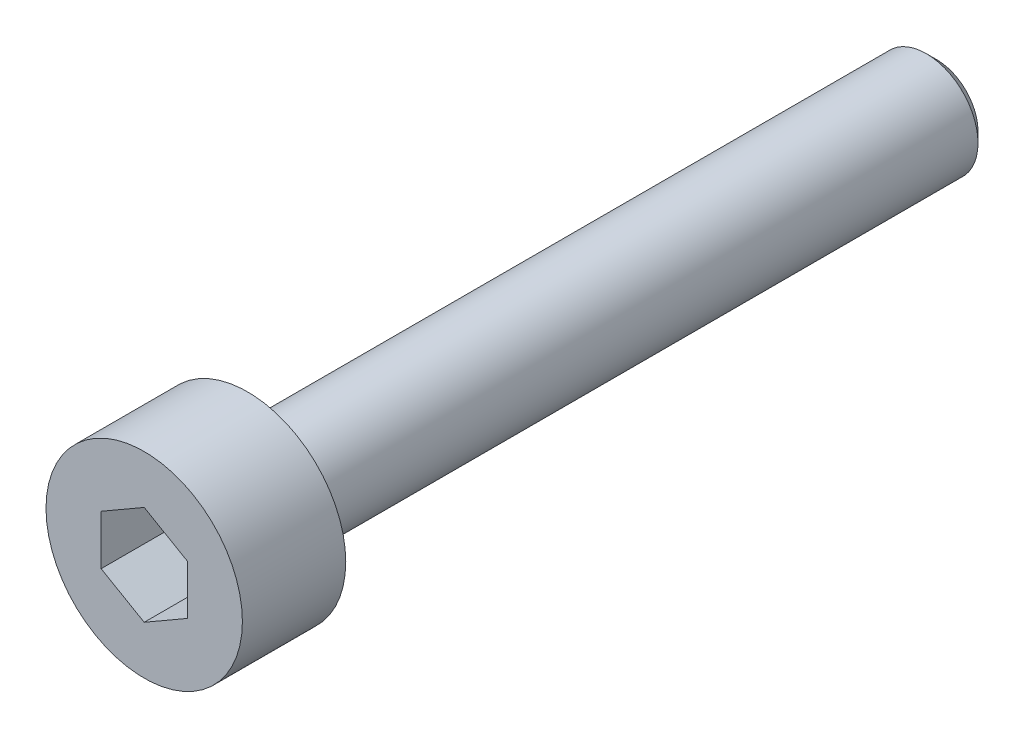
ISO-10303-21;
HEADER;
FILE_DESCRIPTION(('STEP AP214'),'2;1');
FILE_NAME('part.step','',(''),(''),'','','');
FILE_SCHEMA(('AUTOMOTIVE_DESIGN { 1 0 10303 214 1 1 1 1 }'));
ENDSEC;
DATA;
#1=APPLICATION_CONTEXT('core data for automotive mechanical design processes');
#2=APPLICATION_PROTOCOL_DEFINITION('international standard','automotive_design',2000,#1);
#3=PRODUCT_CONTEXT('',#1,'mechanical');
#4=PRODUCT('Part','Part','',(#3));
#5=PRODUCT_RELATED_PRODUCT_CATEGORY('part','',(#4));
#6=PRODUCT_DEFINITION_FORMATION('','',#4);
#7=PRODUCT_DEFINITION_CONTEXT('part definition',#1,'design');
#8=PRODUCT_DEFINITION('design','',#6,#7);
#9=PRODUCT_DEFINITION_SHAPE('','',#8);
#10=(LENGTH_UNIT() NAMED_UNIT(*) SI_UNIT(.MILLI.,.METRE.));
#11=(NAMED_UNIT(*) PLANE_ANGLE_UNIT() SI_UNIT($,.RADIAN.));
#12=(NAMED_UNIT(*) SI_UNIT($,.STERADIAN.) SOLID_ANGLE_UNIT());
#13=UNCERTAINTY_MEASURE_WITH_UNIT(LENGTH_MEASURE(1.E-05),#10,'distance_accuracy_value','');
#14=(GEOMETRIC_REPRESENTATION_CONTEXT(3) GLOBAL_UNCERTAINTY_ASSIGNED_CONTEXT((#13)) GLOBAL_UNIT_ASSIGNED_CONTEXT((#10,
#11,#12)) REPRESENTATION_CONTEXT('',''));
#15=CARTESIAN_POINT('',(0.,0.,0.));
#16=DIRECTION('',(0.,0.,1.));
#17=DIRECTION('',(1.,0.,0.));
#18=AXIS2_PLACEMENT_3D('',#15,#16,#17);
#19=CARTESIAN_POINT('',(0.,0.,0.));
#20=DIRECTION('',(0.,0.,1.));
#21=DIRECTION('',(1.,0.,0.));
#22=AXIS2_PLACEMENT_3D('',#19,#20,#21);
#23=PLANE('',#22);
#24=CARTESIAN_POINT('',(0.,0.,0.));
#25=DIRECTION('',(0.,0.,1.));
#26=DIRECTION('',(1.,0.,0.));
#27=AXIS2_PLACEMENT_3D('',#24,#25,#26);
#28=CIRCLE('',#27,2.85);
#29=CARTESIAN_POINT('',(2.85,0.,0.));
#30=VERTEX_POINT('',#29);
#31=EDGE_CURVE('E171',#30,#30,#28,.T.);
#32=ORIENTED_EDGE('',*,*,#31,.F.);
#33=EDGE_LOOP('',(#32));
#34=FACE_BOUND('',#33,.T.);
#35=CARTESIAN_POINT('',(0.,0.,0.));
#36=DIRECTION('',(0.,0.,1.));
#37=DIRECTION('',(1.,0.,0.));
#38=AXIS2_PLACEMENT_3D('',#35,#36,#37);
#39=CIRCLE('',#38,1.5);
#40=CARTESIAN_POINT('',(1.5,0.,0.));
#41=VERTEX_POINT('',#40);
#42=EDGE_CURVE('E183',#41,#41,#39,.F.);
#43=ORIENTED_EDGE('',*,*,#42,.F.);
#44=EDGE_LOOP('',(#43));
#45=FACE_BOUND('',#44,.T.);
#46=ADVANCED_FACE('F42',(#34,#45),#23,.F.);
#47=CARTESIAN_POINT('',(0.,0.,3.));
#48=DIRECTION('',(0.,0.,-1.));
#49=DIRECTION('',(-1.,0.,0.));
#50=AXIS2_PLACEMENT_3D('',#47,#48,#49);
#51=CYLINDRICAL_SURFACE('',#50,2.85);
#52=CARTESIAN_POINT('',(0.,0.,3.));
#53=DIRECTION('',(0.,0.,1.));
#54=DIRECTION('',(1.,0.,0.));
#55=AXIS2_PLACEMENT_3D('',#52,#53,#54);
#56=CIRCLE('',#55,2.85);
#57=CARTESIAN_POINT('',(2.85,0.,3.));
#58=VERTEX_POINT('',#57);
#59=EDGE_CURVE('E179',#58,#58,#56,.T.);
#60=ORIENTED_EDGE('',*,*,#59,.F.);
#61=EDGE_LOOP('',(#60));
#62=FACE_BOUND('',#61,.T.);
#63=ORIENTED_EDGE('',*,*,#31,.T.);
#64=EDGE_LOOP('',(#63));
#65=FACE_BOUND('',#64,.T.);
#66=ADVANCED_FACE('F208',(#62,#65),#51,.T.);
#67=CARTESIAN_POINT('',(0.,0.,3.));
#68=DIRECTION('',(0.,0.,1.));
#69=DIRECTION('',(1.,0.,0.));
#70=AXIS2_PLACEMENT_3D('',#67,#68,#69);
#71=PLANE('',#70);
#72=DIRECTION('',(-0.866025403784439,0.5,0.));
#73=VECTOR('',#72,1.);
#74=CARTESIAN_POINT('',(1.25,0.721687836487032,3.));
#75=LINE('',#74,#73);
#76=CARTESIAN_POINT('',(1.25,0.721687836487032,3.));
#77=VERTEX_POINT('',#76);
#78=CARTESIAN_POINT('',(0.,1.44337567297406,3.));
#79=VERTEX_POINT('',#78);
#80=EDGE_CURVE('E60',#77,#79,#75,.T.);
#81=ORIENTED_EDGE('',*,*,#80,.F.);
#82=DIRECTION('',(0.,1.,0.));
#83=VECTOR('',#82,1.);
#84=CARTESIAN_POINT('',(1.25,-0.721687836487032,3.));
#85=LINE('',#84,#83);
#86=CARTESIAN_POINT('',(1.25,-0.721687836487032,3.));
#87=VERTEX_POINT('',#86);
#88=EDGE_CURVE('E165',#87,#77,#85,.T.);
#89=ORIENTED_EDGE('',*,*,#88,.F.);
#90=DIRECTION('',(0.866025403784439,0.5,0.));
#91=VECTOR('',#90,1.);
#92=CARTESIAN_POINT('',(0.,-1.44337567297406,3.));
#93=LINE('',#92,#91);
#94=CARTESIAN_POINT('',(0.,-1.44337567297406,3.));
#95=VERTEX_POINT('',#94);
#96=EDGE_CURVE('E162',#95,#87,#93,.T.);
#97=ORIENTED_EDGE('',*,*,#96,.F.);
#98=DIRECTION('',(0.866025403784439,-0.5,0.));
#99=VECTOR('',#98,1.);
#100=CARTESIAN_POINT('',(-1.25,-0.721687836487033,3.));
#101=LINE('',#100,#99);
#102=CARTESIAN_POINT('',(-1.25,-0.721687836487033,3.));
#103=VERTEX_POINT('',#102);
#104=EDGE_CURVE('E118',#103,#95,#101,.T.);
#105=ORIENTED_EDGE('',*,*,#104,.F.);
#106=DIRECTION('',(0.,-1.,0.));
#107=VECTOR('',#106,1.);
#108=CARTESIAN_POINT('',(-1.25,0.721687836487032,3.));
#109=LINE('',#108,#107);
#110=CARTESIAN_POINT('',(-1.25,0.721687836487032,3.));
#111=VERTEX_POINT('',#110);
#112=EDGE_CURVE('E156',#111,#103,#109,.T.);
#113=ORIENTED_EDGE('',*,*,#112,.F.);
#114=DIRECTION('',(-0.866025403784439,-0.5,0.));
#115=VECTOR('',#114,1.);
#116=CARTESIAN_POINT('',(0.,1.44337567297406,3.));
#117=LINE('',#116,#115);
#118=EDGE_CURVE('E152',#79,#111,#117,.T.);
#119=ORIENTED_EDGE('',*,*,#118,.F.);
#120=EDGE_LOOP('',(#81,#89,#97,#105,#113,#119));
#121=FACE_BOUND('',#120,.T.);
#122=ORIENTED_EDGE('',*,*,#59,.T.);
#123=EDGE_LOOP('',(#122));
#124=FACE_BOUND('',#123,.T.);
#125=ADVANCED_FACE('F214',(#121,#124),#71,.T.);
#126=CARTESIAN_POINT('',(0.,0.,-20.));
#127=DIRECTION('',(0.,0.,1.));
#128=DIRECTION('',(1.,0.,0.));
#129=AXIS2_PLACEMENT_3D('',#126,#127,#128);
#130=CYLINDRICAL_SURFACE('',#129,1.5);
#131=CARTESIAN_POINT('',(0.,0.,-19.7));
#132=DIRECTION('',(0.,0.,-1.));
#133=DIRECTION('',(-1.,0.,0.));
#134=AXIS2_PLACEMENT_3D('',#131,#132,#133);
#135=CIRCLE('',#134,1.5);
#136=CARTESIAN_POINT('',(-1.5,0.,-19.7));
#137=VERTEX_POINT('',#136);
#138=EDGE_CURVE('E11',#137,#137,#135,.F.);
#139=ORIENTED_EDGE('',*,*,#138,.T.);
#140=EDGE_LOOP('',(#139));
#141=FACE_BOUND('',#140,.T.);
#142=ORIENTED_EDGE('',*,*,#42,.T.);
#143=EDGE_LOOP('',(#142));
#144=FACE_BOUND('',#143,.T.);
#145=ADVANCED_FACE('F204',(#141,#144),#130,.T.);
#146=CARTESIAN_POINT('',(0.,0.,-20.));
#147=DIRECTION('',(0.,0.,-1.));
#148=DIRECTION('',(-1.,0.,0.));
#149=AXIS2_PLACEMENT_3D('',#146,#147,#148);
#150=PLANE('',#149);
#151=CARTESIAN_POINT('',(0.,0.,-20.));
#152=DIRECTION('',(0.,0.,-1.));
#153=DIRECTION('',(-1.,0.,0.));
#154=AXIS2_PLACEMENT_3D('',#151,#152,#153);
#155=CIRCLE('',#154,1.2);
#156=CARTESIAN_POINT('',(-1.2,0.,-20.));
#157=VERTEX_POINT('',#156);
#158=EDGE_CURVE('E51',#157,#157,#155,.T.);
#159=ORIENTED_EDGE('',*,*,#158,.T.);
#160=EDGE_LOOP('',(#159));
#161=FACE_BOUND('',#160,.T.);
#162=ADVANCED_FACE('F193',(#161),#150,.T.);
#163=CARTESIAN_POINT('',(0.,0.,-20.));
#164=DIRECTION('',(0.,0.,1.));
#165=DIRECTION('',(1.,0.,0.));
#166=AXIS2_PLACEMENT_3D('',#163,#164,#165);
#167=CONICAL_SURFACE('',#166,1.2,0.785398163397447);
#168=ORIENTED_EDGE('',*,*,#138,.F.);
#169=EDGE_LOOP('',(#168));
#170=FACE_BOUND('',#169,.T.);
#171=ORIENTED_EDGE('',*,*,#158,.F.);
#172=EDGE_LOOP('',(#171));
#173=FACE_BOUND('',#172,.T.);
#174=ADVANCED_FACE('F44',(#170,#173),#167,.T.);
#175=CARTESIAN_POINT('',(1.25,0.721687836487032,1.));
#176=DIRECTION('',(0.5,0.866025403784439,0.));
#177=DIRECTION('',(-0.866025403784439,0.5,0.));
#178=AXIS2_PLACEMENT_3D('',#175,#176,#177);
#179=PLANE('',#178);
#180=ORIENTED_EDGE('',*,*,#80,.T.);
#181=DIRECTION('',(0.,0.,1.));
#182=VECTOR('',#181,1.);
#183=CARTESIAN_POINT('',(0.,1.44337567297406,1.));
#184=LINE('',#183,#182);
#185=CARTESIAN_POINT('',(0.,1.44337567297406,1.));
#186=VERTEX_POINT('',#185);
#187=EDGE_CURVE('E97',#186,#79,#184,.T.);
#188=ORIENTED_EDGE('',*,*,#187,.F.);
#189=DIRECTION('',(-0.866025403784439,0.5,0.));
#190=VECTOR('',#189,1.);
#191=CARTESIAN_POINT('',(1.25,0.721687836487032,1.));
#192=LINE('',#191,#190);
#193=CARTESIAN_POINT('',(1.25,0.721687836487032,1.));
#194=VERTEX_POINT('',#193);
#195=EDGE_CURVE('E168',#194,#186,#192,.T.);
#196=ORIENTED_EDGE('',*,*,#195,.F.);
#197=DIRECTION('',(0.,0.,1.));
#198=VECTOR('',#197,1.);
#199=CARTESIAN_POINT('',(1.25,0.721687836487032,1.));
#200=LINE('',#199,#198);
#201=EDGE_CURVE('E71',#194,#77,#200,.T.);
#202=ORIENTED_EDGE('',*,*,#201,.T.);
#203=EDGE_LOOP('',(#180,#188,#196,#202));
#204=FACE_BOUND('',#203,.T.);
#205=ADVANCED_FACE('F196',(#204),#179,.F.);
#206=CARTESIAN_POINT('',(1.25,-0.721687836487032,1.));
#207=DIRECTION('',(1.,0.,0.));
#208=DIRECTION('',(0.,1.,0.));
#209=AXIS2_PLACEMENT_3D('',#206,#207,#208);
#210=PLANE('',#209);
#211=ORIENTED_EDGE('',*,*,#88,.T.);
#212=ORIENTED_EDGE('',*,*,#201,.F.);
#213=DIRECTION('',(0.,1.,0.));
#214=VECTOR('',#213,1.);
#215=CARTESIAN_POINT('',(1.25,-0.721687836487032,1.));
#216=LINE('',#215,#214);
#217=CARTESIAN_POINT('',(1.25,-0.721687836487032,1.));
#218=VERTEX_POINT('',#217);
#219=EDGE_CURVE('E132',#218,#194,#216,.T.);
#220=ORIENTED_EDGE('',*,*,#219,.F.);
#221=DIRECTION('',(0.,0.,1.));
#222=VECTOR('',#221,1.);
#223=CARTESIAN_POINT('',(1.25,-0.721687836487032,1.));
#224=LINE('',#223,#222);
#225=EDGE_CURVE('E123',#218,#87,#224,.T.);
#226=ORIENTED_EDGE('',*,*,#225,.T.);
#227=EDGE_LOOP('',(#211,#212,#220,#226));
#228=FACE_BOUND('',#227,.T.);
#229=ADVANCED_FACE('F202',(#228),#210,.F.);
#230=CARTESIAN_POINT('',(0.,-1.44337567297406,1.));
#231=DIRECTION('',(0.5,-0.866025403784439,0.));
#232=DIRECTION('',(0.866025403784439,0.5,0.));
#233=AXIS2_PLACEMENT_3D('',#230,#231,#232);
#234=PLANE('',#233);
#235=ORIENTED_EDGE('',*,*,#96,.T.);
#236=ORIENTED_EDGE('',*,*,#225,.F.);
#237=DIRECTION('',(0.866025403784439,0.5,0.));
#238=VECTOR('',#237,1.);
#239=CARTESIAN_POINT('',(0.,-1.44337567297406,1.));
#240=LINE('',#239,#238);
#241=CARTESIAN_POINT('',(0.,-1.44337567297406,1.));
#242=VERTEX_POINT('',#241);
#243=EDGE_CURVE('E127',#242,#218,#240,.T.);
#244=ORIENTED_EDGE('',*,*,#243,.F.);
#245=DIRECTION('',(0.,0.,1.));
#246=VECTOR('',#245,1.);
#247=CARTESIAN_POINT('',(0.,-1.44337567297406,1.));
#248=LINE('',#247,#246);
#249=EDGE_CURVE('E111',#242,#95,#248,.T.);
#250=ORIENTED_EDGE('',*,*,#249,.T.);
#251=EDGE_LOOP('',(#235,#236,#244,#250));
#252=FACE_BOUND('',#251,.T.);
#253=ADVANCED_FACE('F128',(#252),#234,.F.);
#254=CARTESIAN_POINT('',(-1.25,-0.721687836487033,1.));
#255=DIRECTION('',(-0.5,-0.866025403784439,0.));
#256=DIRECTION('',(0.866025403784439,-0.5,0.));
#257=AXIS2_PLACEMENT_3D('',#254,#255,#256);
#258=PLANE('',#257);
#259=ORIENTED_EDGE('',*,*,#104,.T.);
#260=ORIENTED_EDGE('',*,*,#249,.F.);
#261=DIRECTION('',(0.866025403784439,-0.5,0.));
#262=VECTOR('',#261,1.);
#263=CARTESIAN_POINT('',(-1.25,-0.721687836487033,1.));
#264=LINE('',#263,#262);
#265=CARTESIAN_POINT('',(-1.25,-0.721687836487033,1.));
#266=VERTEX_POINT('',#265);
#267=EDGE_CURVE('E115',#266,#242,#264,.T.);
#268=ORIENTED_EDGE('',*,*,#267,.F.);
#269=DIRECTION('',(0.,0.,1.));
#270=VECTOR('',#269,1.);
#271=CARTESIAN_POINT('',(-1.25,-0.721687836487033,1.));
#272=LINE('',#271,#270);
#273=EDGE_CURVE('E124',#266,#103,#272,.T.);
#274=ORIENTED_EDGE('',*,*,#273,.T.);
#275=EDGE_LOOP('',(#259,#260,#268,#274));
#276=FACE_BOUND('',#275,.T.);
#277=ADVANCED_FACE('F113',(#276),#258,.F.);
#278=CARTESIAN_POINT('',(-1.25,0.721687836487032,1.));
#279=DIRECTION('',(-1.,0.,0.));
#280=DIRECTION('',(0.,0.,1.));
#281=AXIS2_PLACEMENT_3D('',#278,#279,#280);
#282=PLANE('',#281);
#283=ORIENTED_EDGE('',*,*,#112,.T.);
#284=ORIENTED_EDGE('',*,*,#273,.F.);
#285=DIRECTION('',(0.,-1.,0.));
#286=VECTOR('',#285,1.);
#287=CARTESIAN_POINT('',(-1.25,0.721687836487032,1.));
#288=LINE('',#287,#286);
#289=CARTESIAN_POINT('',(-1.25,0.721687836487032,1.));
#290=VERTEX_POINT('',#289);
#291=EDGE_CURVE('E138',#290,#266,#288,.T.);
#292=ORIENTED_EDGE('',*,*,#291,.F.);
#293=DIRECTION('',(0.,0.,1.));
#294=VECTOR('',#293,1.);
#295=CARTESIAN_POINT('',(-1.25,0.721687836487032,1.));
#296=LINE('',#295,#294);
#297=EDGE_CURVE('E174',#290,#111,#296,.T.);
#298=ORIENTED_EDGE('',*,*,#297,.T.);
#299=EDGE_LOOP('',(#283,#284,#292,#298));
#300=FACE_BOUND('',#299,.T.);
#301=ADVANCED_FACE('F228',(#300),#282,.F.);
#302=CARTESIAN_POINT('',(0.,1.44337567297406,1.));
#303=DIRECTION('',(-0.5,0.866025403784439,0.));
#304=DIRECTION('',(-0.866025403784439,-0.5,0.));
#305=AXIS2_PLACEMENT_3D('',#302,#303,#304);
#306=PLANE('',#305);
#307=ORIENTED_EDGE('',*,*,#118,.T.);
#308=ORIENTED_EDGE('',*,*,#297,.F.);
#309=DIRECTION('',(-0.866025403784439,-0.5,0.));
#310=VECTOR('',#309,1.);
#311=CARTESIAN_POINT('',(0.,1.44337567297406,1.));
#312=LINE('',#311,#310);
#313=EDGE_CURVE('E144',#186,#290,#312,.T.);
#314=ORIENTED_EDGE('',*,*,#313,.F.);
#315=ORIENTED_EDGE('',*,*,#187,.T.);
#316=EDGE_LOOP('',(#307,#308,#314,#315));
#317=FACE_BOUND('',#316,.T.);
#318=ADVANCED_FACE('F225',(#317),#306,.F.);
#319=CARTESIAN_POINT('',(0.,0.,1.));
#320=DIRECTION('',(0.,0.,1.));
#321=DIRECTION('',(1.,0.,0.));
#322=AXIS2_PLACEMENT_3D('',#319,#320,#321);
#323=PLANE('',#322);
#324=ORIENTED_EDGE('',*,*,#195,.T.);
#325=ORIENTED_EDGE('',*,*,#313,.T.);
#326=ORIENTED_EDGE('',*,*,#291,.T.);
#327=ORIENTED_EDGE('',*,*,#267,.T.);
#328=ORIENTED_EDGE('',*,*,#243,.T.);
#329=ORIENTED_EDGE('',*,*,#219,.T.);
#330=EDGE_LOOP('',(#324,#325,#326,#327,#328,#329));
#331=FACE_BOUND('',#330,.T.);
#332=ADVANCED_FACE('F135',(#331),#323,.T.);
#333=CLOSED_SHELL('',(#46,#66,#125,#145,#162,#174,#205,#229,#253,#277,#301,#318,#332));
#334=MANIFOLD_SOLID_BREP('B2',#333);
#335=ADVANCED_BREP_SHAPE_REPRESENTATION('',(#18,#334),#14);
#336=SHAPE_DEFINITION_REPRESENTATION(#9,#335);
ENDSEC;
END-ISO-10303-21;
